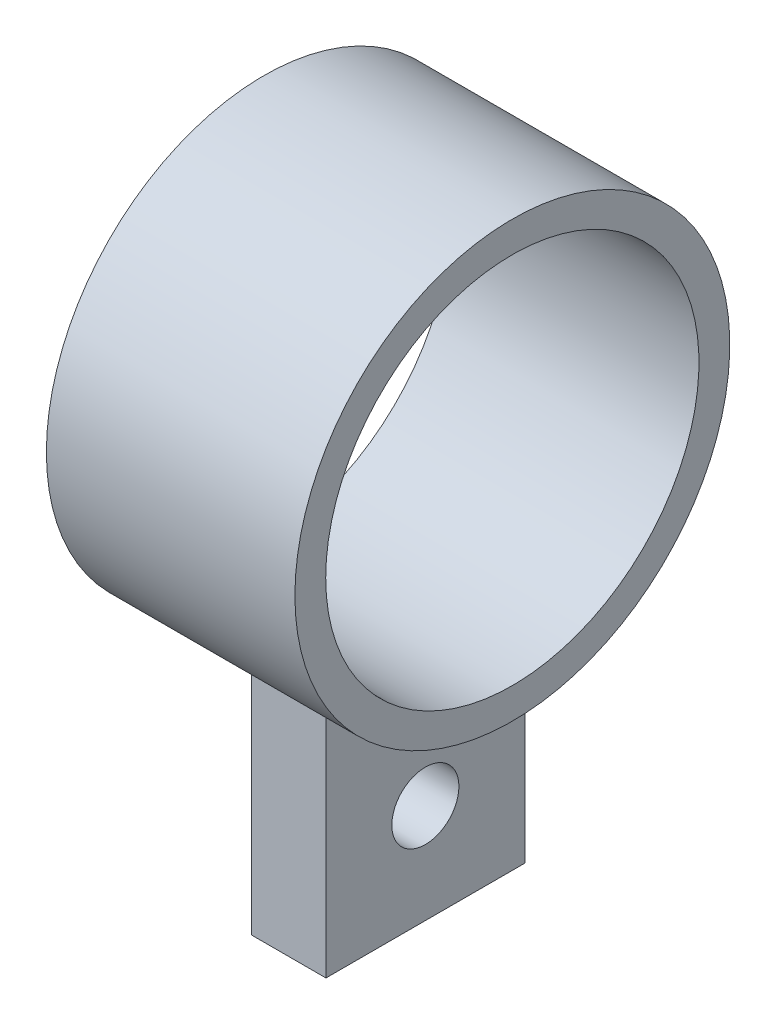
ISO-10303-21;
HEADER;
FILE_DESCRIPTION(('STEP AP214'),'2;1');
FILE_NAME('part.step','',(''),(''),'','','');
FILE_SCHEMA(('AUTOMOTIVE_DESIGN { 1 0 10303 214 1 1 1 1 }'));
ENDSEC;
DATA;
#1=APPLICATION_CONTEXT('core data for automotive mechanical design processes');
#2=APPLICATION_PROTOCOL_DEFINITION('international standard','automotive_design',2000,#1);
#3=PRODUCT_CONTEXT('',#1,'mechanical');
#4=PRODUCT('Part','Part','',(#3));
#5=PRODUCT_RELATED_PRODUCT_CATEGORY('part','',(#4));
#6=PRODUCT_DEFINITION_FORMATION('','',#4);
#7=PRODUCT_DEFINITION_CONTEXT('part definition',#1,'design');
#8=PRODUCT_DEFINITION('design','',#6,#7);
#9=PRODUCT_DEFINITION_SHAPE('','',#8);
#10=(LENGTH_UNIT() NAMED_UNIT(*) SI_UNIT(.MILLI.,.METRE.));
#11=(NAMED_UNIT(*) PLANE_ANGLE_UNIT() SI_UNIT($,.RADIAN.));
#12=(NAMED_UNIT(*) SI_UNIT($,.STERADIAN.) SOLID_ANGLE_UNIT());
#13=UNCERTAINTY_MEASURE_WITH_UNIT(LENGTH_MEASURE(1.E-05),#10,'distance_accuracy_value','');
#14=(GEOMETRIC_REPRESENTATION_CONTEXT(3) GLOBAL_UNCERTAINTY_ASSIGNED_CONTEXT((#13)) GLOBAL_UNIT_ASSIGNED_CONTEXT((#10,
#11,#12)) REPRESENTATION_CONTEXT('',''));
#15=CARTESIAN_POINT('',(0.,0.,0.));
#16=DIRECTION('',(0.,0.,1.));
#17=DIRECTION('',(1.,0.,0.));
#18=AXIS2_PLACEMENT_3D('',#15,#16,#17);
#19=CARTESIAN_POINT('',(232.635235802985,17.5,0.));
#20=DIRECTION('',(1.,0.,0.));
#21=DIRECTION('',(0.,0.,-1.));
#22=AXIS2_PLACEMENT_3D('',#19,#20,#21);
#23=PLANE('',#22);
#24=CARTESIAN_POINT('',(232.635235802985,0.,0.));
#25=DIRECTION('',(-1.,0.,0.));
#26=DIRECTION('',(0.,0.,1.));
#27=AXIS2_PLACEMENT_3D('',#24,#25,#26);
#28=CIRCLE('',#27,15.02);
#29=CARTESIAN_POINT('',(232.635235802985,0.,15.02));
#30=VERTEX_POINT('',#29);
#31=EDGE_CURVE('E112',#30,#30,#28,.T.);
#32=ORIENTED_EDGE('',*,*,#31,.F.);
#33=EDGE_LOOP('',(#32));
#34=FACE_BOUND('',#33,.T.);
#35=CARTESIAN_POINT('',(232.635235802985,0.,0.));
#36=DIRECTION('',(-1.,0.,0.));
#37=DIRECTION('',(0.,0.,1.));
#38=AXIS2_PLACEMENT_3D('',#35,#36,#37);
#39=CIRCLE('',#38,17.5);
#40=CARTESIAN_POINT('',(232.635235802985,0.,17.5));
#41=VERTEX_POINT('',#40);
#42=EDGE_CURVE('E98',#41,#41,#39,.T.);
#43=ORIENTED_EDGE('',*,*,#42,.T.);
#44=EDGE_LOOP('',(#43));
#45=FACE_BOUND('',#44,.T.);
#46=ADVANCED_FACE('F41',(#34,#45),#23,.F.);
#47=CARTESIAN_POINT('',(-3000.,0.,0.));
#48=DIRECTION('',(-1.,0.,0.));
#49=DIRECTION('',(0.,0.,1.));
#50=AXIS2_PLACEMENT_3D('',#47,#48,#49);
#51=CYLINDRICAL_SURFACE('',#50,15.02);
#52=CARTESIAN_POINT('',(252.635235802985,0.,0.));
#53=DIRECTION('',(-1.,0.,0.));
#54=DIRECTION('',(0.,0.,1.));
#55=AXIS2_PLACEMENT_3D('',#52,#53,#54);
#56=CIRCLE('',#55,15.02);
#57=CARTESIAN_POINT('',(252.635235802985,0.,15.02));
#58=VERTEX_POINT('',#57);
#59=EDGE_CURVE('E107',#58,#58,#56,.T.);
#60=ORIENTED_EDGE('',*,*,#59,.F.);
#61=EDGE_LOOP('',(#60));
#62=FACE_BOUND('',#61,.T.);
#63=ORIENTED_EDGE('',*,*,#31,.T.);
#64=EDGE_LOOP('',(#63));
#65=FACE_BOUND('',#64,.T.);
#66=ADVANCED_FACE('F141',(#62,#65),#51,.F.);
#67=CARTESIAN_POINT('',(252.635235802985,15.02,0.));
#68=DIRECTION('',(-1.,0.,0.));
#69=DIRECTION('',(0.,0.,1.));
#70=AXIS2_PLACEMENT_3D('',#67,#68,#69);
#71=PLANE('',#70);
#72=CARTESIAN_POINT('',(252.635235802985,0.,0.));
#73=DIRECTION('',(-1.,0.,0.));
#74=DIRECTION('',(0.,0.,1.));
#75=AXIS2_PLACEMENT_3D('',#72,#73,#74);
#76=CIRCLE('',#75,17.5);
#77=CARTESIAN_POINT('',(252.635235802985,0.,17.5));
#78=VERTEX_POINT('',#77);
#79=EDGE_CURVE('E101',#78,#78,#76,.T.);
#80=ORIENTED_EDGE('',*,*,#79,.F.);
#81=EDGE_LOOP('',(#80));
#82=FACE_BOUND('',#81,.T.);
#83=ORIENTED_EDGE('',*,*,#59,.T.);
#84=EDGE_LOOP('',(#83));
#85=FACE_BOUND('',#84,.T.);
#86=ADVANCED_FACE('F134',(#82,#85),#71,.F.);
#87=CARTESIAN_POINT('',(-3000.,0.,0.));
#88=DIRECTION('',(-1.,0.,0.));
#89=DIRECTION('',(0.,0.,1.));
#90=AXIS2_PLACEMENT_3D('',#87,#88,#89);
#91=CYLINDRICAL_SURFACE('',#90,17.5);
#92=CARTESIAN_POINT('',(239.635235802985,0.,0.));
#93=DIRECTION('',(1.,0.,0.));
#94=DIRECTION('',(0.,0.,-1.));
#95=AXIS2_PLACEMENT_3D('',#92,#93,#94);
#96=CIRCLE('',#95,17.5);
#97=CARTESIAN_POINT('',(239.635235802985,-15.5643824162734,8.));
#98=VERTEX_POINT('',#97);
#99=CARTESIAN_POINT('',(239.635235802985,-15.5643824162734,-8.));
#100=VERTEX_POINT('',#99);
#101=EDGE_CURVE('E48',#98,#100,#96,.T.);
#102=ORIENTED_EDGE('',*,*,#101,.F.);
#103=DIRECTION('',(-1.,0.,0.));
#104=VECTOR('',#103,1.);
#105=CARTESIAN_POINT('',(-3000.,-15.5643824162734,8.));
#106=LINE('',#105,#104);
#107=CARTESIAN_POINT('',(245.635235802985,-15.5643824162734,8.));
#108=VERTEX_POINT('',#107);
#109=EDGE_CURVE('E11',#98,#108,#106,.F.);
#110=ORIENTED_EDGE('',*,*,#109,.T.);
#111=CARTESIAN_POINT('',(245.635235802985,0.,0.));
#112=DIRECTION('',(-1.,0.,0.));
#113=DIRECTION('',(0.,0.,1.));
#114=AXIS2_PLACEMENT_3D('',#111,#112,#113);
#115=CIRCLE('',#114,17.5);
#116=CARTESIAN_POINT('',(245.635235802985,-15.5643824162734,-8.));
#117=VERTEX_POINT('',#116);
#118=EDGE_CURVE('E120',#117,#108,#115,.T.);
#119=ORIENTED_EDGE('',*,*,#118,.F.);
#120=DIRECTION('',(-1.,0.,0.));
#121=VECTOR('',#120,1.);
#122=CARTESIAN_POINT('',(-3000.,-15.5643824162734,-8.));
#123=LINE('',#122,#121);
#124=EDGE_CURVE('E111',#100,#117,#123,.F.);
#125=ORIENTED_EDGE('',*,*,#124,.F.);
#126=EDGE_LOOP('',(#102,#110,#119,#125));
#127=FACE_BOUND('',#126,.T.);
#128=ORIENTED_EDGE('',*,*,#42,.F.);
#129=EDGE_LOOP('',(#128));
#130=FACE_BOUND('',#129,.T.);
#131=ORIENTED_EDGE('',*,*,#79,.T.);
#132=EDGE_LOOP('',(#131));
#133=FACE_BOUND('',#132,.T.);
#134=ADVANCED_FACE('F135',(#127,#130,#133),#91,.T.);
#135=CARTESIAN_POINT('',(239.635235802985,-34.896697693763,8.));
#136=DIRECTION('',(0.,1.,0.));
#137=DIRECTION('',(0.,0.,1.));
#138=AXIS2_PLACEMENT_3D('',#135,#136,#137);
#139=PLANE('',#138);
#140=DIRECTION('',(1.,0.,0.));
#141=VECTOR('',#140,1.);
#142=CARTESIAN_POINT('',(239.635235802985,-34.896697693763,-8.));
#143=LINE('',#142,#141);
#144=CARTESIAN_POINT('',(239.635235802985,-34.896697693763,-8.));
#145=VERTEX_POINT('',#144);
#146=CARTESIAN_POINT('',(245.635235802985,-34.896697693763,-8.));
#147=VERTEX_POINT('',#146);
#148=EDGE_CURVE('E122',#145,#147,#143,.T.);
#149=ORIENTED_EDGE('',*,*,#148,.T.);
#150=DIRECTION('',(0.,0.,-1.));
#151=VECTOR('',#150,1.);
#152=CARTESIAN_POINT('',(245.635235802985,-34.896697693763,8.));
#153=LINE('',#152,#151);
#154=CARTESIAN_POINT('',(245.635235802985,-34.896697693763,8.));
#155=VERTEX_POINT('',#154);
#156=EDGE_CURVE('E89',#155,#147,#153,.T.);
#157=ORIENTED_EDGE('',*,*,#156,.F.);
#158=DIRECTION('',(1.,0.,0.));
#159=VECTOR('',#158,1.);
#160=CARTESIAN_POINT('',(239.635235802985,-34.896697693763,8.));
#161=LINE('',#160,#159);
#162=CARTESIAN_POINT('',(239.635235802985,-34.896697693763,8.));
#163=VERTEX_POINT('',#162);
#164=EDGE_CURVE('E77',#163,#155,#161,.T.);
#165=ORIENTED_EDGE('',*,*,#164,.F.);
#166=DIRECTION('',(0.,0.,-1.));
#167=VECTOR('',#166,1.);
#168=CARTESIAN_POINT('',(239.635235802985,-34.896697693763,8.));
#169=LINE('',#168,#167);
#170=EDGE_CURVE('E86',#163,#145,#169,.T.);
#171=ORIENTED_EDGE('',*,*,#170,.T.);
#172=EDGE_LOOP('',(#149,#157,#165,#171));
#173=FACE_BOUND('',#172,.T.);
#174=ADVANCED_FACE('F87',(#173),#139,.F.);
#175=CARTESIAN_POINT('',(0.,0.,8.));
#176=DIRECTION('',(0.,0.,1.));
#177=DIRECTION('',(1.,0.,0.));
#178=AXIS2_PLACEMENT_3D('',#175,#176,#177);
#179=PLANE('',#178);
#180=ORIENTED_EDGE('',*,*,#109,.F.);
#181=DIRECTION('',(0.,-1.,0.));
#182=VECTOR('',#181,1.);
#183=CARTESIAN_POINT('',(239.635235802985,-8.,8.));
#184=LINE('',#183,#182);
#185=EDGE_CURVE('E73',#98,#163,#184,.T.);
#186=ORIENTED_EDGE('',*,*,#185,.T.);
#187=ORIENTED_EDGE('',*,*,#164,.T.);
#188=DIRECTION('',(0.,1.,0.));
#189=VECTOR('',#188,1.);
#190=CARTESIAN_POINT('',(245.635235802985,-34.896697693763,8.));
#191=LINE('',#190,#189);
#192=EDGE_CURVE('E95',#155,#108,#191,.T.);
#193=ORIENTED_EDGE('',*,*,#192,.T.);
#194=EDGE_LOOP('',(#180,#186,#187,#193));
#195=FACE_BOUND('',#194,.T.);
#196=ADVANCED_FACE('F80',(#195),#179,.T.);
#197=CARTESIAN_POINT('',(0.,0.,-8.));
#198=DIRECTION('',(0.,0.,1.));
#199=DIRECTION('',(1.,0.,0.));
#200=AXIS2_PLACEMENT_3D('',#197,#198,#199);
#201=PLANE('',#200);
#202=DIRECTION('',(0.,-1.,0.));
#203=VECTOR('',#202,1.);
#204=CARTESIAN_POINT('',(239.635235802985,-8.,-8.));
#205=LINE('',#204,#203);
#206=EDGE_CURVE('E96',#100,#145,#205,.T.);
#207=ORIENTED_EDGE('',*,*,#206,.F.);
#208=ORIENTED_EDGE('',*,*,#124,.T.);
#209=DIRECTION('',(0.,1.,0.));
#210=VECTOR('',#209,1.);
#211=CARTESIAN_POINT('',(245.635235802985,-34.896697693763,-8.));
#212=LINE('',#211,#210);
#213=EDGE_CURVE('E84',#147,#117,#212,.T.);
#214=ORIENTED_EDGE('',*,*,#213,.F.);
#215=ORIENTED_EDGE('',*,*,#148,.F.);
#216=EDGE_LOOP('',(#207,#208,#214,#215));
#217=FACE_BOUND('',#216,.T.);
#218=ADVANCED_FACE('F117',(#217),#201,.F.);
#219=CARTESIAN_POINT('',(245.635235802985,-34.896697693763,8.));
#220=DIRECTION('',(-1.,0.,0.));
#221=DIRECTION('',(0.,0.,1.));
#222=AXIS2_PLACEMENT_3D('',#219,#220,#221);
#223=PLANE('',#222);
#224=CARTESIAN_POINT('',(245.635235802985,-26.896697693763,0.));
#225=DIRECTION('',(1.,0.,0.));
#226=DIRECTION('',(0.,0.,-1.));
#227=AXIS2_PLACEMENT_3D('',#224,#225,#226);
#228=CIRCLE('',#227,2.7);
#229=CARTESIAN_POINT('',(245.635235802985,-26.896697693763,-2.7));
#230=VERTEX_POINT('',#229);
#231=EDGE_CURVE('E124',#230,#230,#228,.T.);
#232=ORIENTED_EDGE('',*,*,#231,.F.);
#233=EDGE_LOOP('',(#232));
#234=FACE_BOUND('',#233,.T.);
#235=ORIENTED_EDGE('',*,*,#213,.T.);
#236=ORIENTED_EDGE('',*,*,#118,.T.);
#237=ORIENTED_EDGE('',*,*,#192,.F.);
#238=ORIENTED_EDGE('',*,*,#156,.T.);
#239=EDGE_LOOP('',(#235,#236,#237,#238));
#240=FACE_BOUND('',#239,.T.);
#241=ADVANCED_FACE('F133',(#234,#240),#223,.F.);
#242=CARTESIAN_POINT('',(239.635235802985,-8.,8.));
#243=DIRECTION('',(1.,0.,0.));
#244=DIRECTION('',(0.,0.,-1.));
#245=AXIS2_PLACEMENT_3D('',#242,#243,#244);
#246=PLANE('',#245);
#247=CARTESIAN_POINT('',(239.635235802985,-26.896697693763,0.));
#248=DIRECTION('',(1.,0.,0.));
#249=DIRECTION('',(0.,0.,-1.));
#250=AXIS2_PLACEMENT_3D('',#247,#248,#249);
#251=CIRCLE('',#250,2.7);
#252=CARTESIAN_POINT('',(239.635235802985,-26.896697693763,-2.7));
#253=VERTEX_POINT('',#252);
#254=EDGE_CURVE('E130',#253,#253,#251,.T.);
#255=ORIENTED_EDGE('',*,*,#254,.T.);
#256=EDGE_LOOP('',(#255));
#257=FACE_BOUND('',#256,.T.);
#258=ORIENTED_EDGE('',*,*,#185,.F.);
#259=ORIENTED_EDGE('',*,*,#101,.T.);
#260=ORIENTED_EDGE('',*,*,#206,.T.);
#261=ORIENTED_EDGE('',*,*,#170,.F.);
#262=EDGE_LOOP('',(#258,#259,#260,#261));
#263=FACE_BOUND('',#262,.T.);
#264=ADVANCED_FACE('F94',(#257,#263),#246,.F.);
#265=CARTESIAN_POINT('',(245.635235802985,-26.896697693763,0.));
#266=DIRECTION('',(-1.,0.,0.));
#267=DIRECTION('',(0.,0.,1.));
#268=AXIS2_PLACEMENT_3D('',#265,#266,#267);
#269=CYLINDRICAL_SURFACE('',#268,2.7);
#270=ORIENTED_EDGE('',*,*,#231,.T.);
#271=EDGE_LOOP('',(#270));
#272=FACE_BOUND('',#271,.T.);
#273=ORIENTED_EDGE('',*,*,#254,.F.);
#274=EDGE_LOOP('',(#273));
#275=FACE_BOUND('',#274,.T.);
#276=ADVANCED_FACE('F210',(#272,#275),#269,.F.);
#277=CLOSED_SHELL('',(#46,#66,#86,#134,#174,#196,#218,#241,#264,#276));
#278=MANIFOLD_SOLID_BREP('B2',#277);
#279=ADVANCED_BREP_SHAPE_REPRESENTATION('',(#18,#278),#14);
#280=SHAPE_DEFINITION_REPRESENTATION(#9,#279);
ENDSEC;
END-ISO-10303-21;
